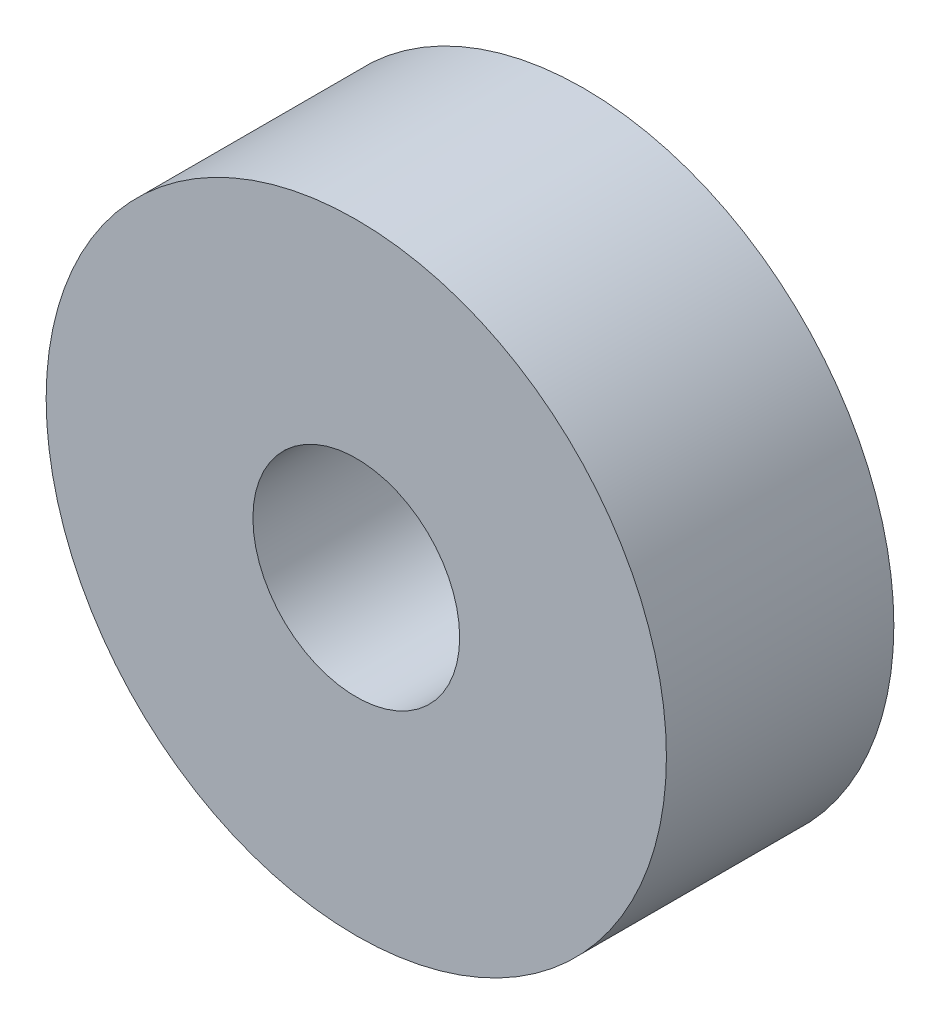
ISO-10303-21;
HEADER;
FILE_DESCRIPTION(('STEP AP214'),'2;1');
FILE_NAME('part.step','',(''),(''),'','','');
FILE_SCHEMA(('AUTOMOTIVE_DESIGN { 1 0 10303 214 1 1 1 1 }'));
ENDSEC;
DATA;
#1=APPLICATION_CONTEXT('core data for automotive mechanical design processes');
#2=APPLICATION_PROTOCOL_DEFINITION('international standard','automotive_design',2000,#1);
#3=PRODUCT_CONTEXT('',#1,'mechanical');
#4=PRODUCT('Part','Part','',(#3));
#5=PRODUCT_RELATED_PRODUCT_CATEGORY('part','',(#4));
#6=PRODUCT_DEFINITION_FORMATION('','',#4);
#7=PRODUCT_DEFINITION_CONTEXT('part definition',#1,'design');
#8=PRODUCT_DEFINITION('design','',#6,#7);
#9=PRODUCT_DEFINITION_SHAPE('','',#8);
#10=(LENGTH_UNIT() NAMED_UNIT(*) SI_UNIT(.MILLI.,.METRE.));
#11=(NAMED_UNIT(*) PLANE_ANGLE_UNIT() SI_UNIT($,.RADIAN.));
#12=(NAMED_UNIT(*) SI_UNIT($,.STERADIAN.) SOLID_ANGLE_UNIT());
#13=UNCERTAINTY_MEASURE_WITH_UNIT(LENGTH_MEASURE(1.E-05),#10,'distance_accuracy_value','');
#14=(GEOMETRIC_REPRESENTATION_CONTEXT(3) GLOBAL_UNCERTAINTY_ASSIGNED_CONTEXT((#13)) GLOBAL_UNIT_ASSIGNED_CONTEXT((#10,
#11,#12)) REPRESENTATION_CONTEXT('',''));
#15=CARTESIAN_POINT('',(0.,0.,0.));
#16=DIRECTION('',(0.,0.,1.));
#17=DIRECTION('',(1.,0.,0.));
#18=AXIS2_PLACEMENT_3D('',#15,#16,#17);
#19=CARTESIAN_POINT('',(0.,0.,2.2));
#20=DIRECTION('',(0.,0.,1.));
#21=DIRECTION('',(1.,0.,0.));
#22=AXIS2_PLACEMENT_3D('',#19,#20,#21);
#23=PLANE('',#22);
#24=CARTESIAN_POINT('',(0.,0.,2.2));
#25=DIRECTION('',(0.,0.,1.));
#26=DIRECTION('',(1.,0.,0.));
#27=AXIS2_PLACEMENT_3D('',#24,#25,#26);
#28=CIRCLE('',#27,3.);
#29=CARTESIAN_POINT('',(3.,0.,2.2));
#30=VERTEX_POINT('',#29);
#31=EDGE_CURVE('E10',#30,#30,#28,.T.);
#32=ORIENTED_EDGE('',*,*,#31,.T.);
#33=EDGE_LOOP('',(#32));
#34=FACE_BOUND('',#33,.T.);
#35=CARTESIAN_POINT('',(0.,0.,2.2));
#36=DIRECTION('',(0.,0.,1.));
#37=DIRECTION('',(1.,0.,0.));
#38=AXIS2_PLACEMENT_3D('',#35,#36,#37);
#39=CIRCLE('',#38,1.);
#40=CARTESIAN_POINT('',(1.,0.,2.2));
#41=VERTEX_POINT('',#40);
#42=EDGE_CURVE('E42',#41,#41,#39,.T.);
#43=ORIENTED_EDGE('',*,*,#42,.F.);
#44=EDGE_LOOP('',(#43));
#45=FACE_BOUND('',#44,.T.);
#46=ADVANCED_FACE('F31',(#34,#45),#23,.T.);
#47=CARTESIAN_POINT('',(0.,0.,0.));
#48=DIRECTION('',(0.,0.,1.));
#49=DIRECTION('',(1.,0.,0.));
#50=AXIS2_PLACEMENT_3D('',#47,#48,#49);
#51=PLANE('',#50);
#52=CARTESIAN_POINT('',(0.,0.,0.));
#53=DIRECTION('',(0.,0.,1.));
#54=DIRECTION('',(1.,0.,0.));
#55=AXIS2_PLACEMENT_3D('',#52,#53,#54);
#56=CIRCLE('',#55,3.);
#57=CARTESIAN_POINT('',(3.,0.,0.));
#58=VERTEX_POINT('',#57);
#59=EDGE_CURVE('E35',#58,#58,#56,.T.);
#60=ORIENTED_EDGE('',*,*,#59,.F.);
#61=EDGE_LOOP('',(#60));
#62=FACE_BOUND('',#61,.T.);
#63=CARTESIAN_POINT('',(0.,0.,0.));
#64=DIRECTION('',(0.,0.,1.));
#65=DIRECTION('',(1.,0.,0.));
#66=AXIS2_PLACEMENT_3D('',#63,#64,#65);
#67=CIRCLE('',#66,1.);
#68=CARTESIAN_POINT('',(1.,0.,0.));
#69=VERTEX_POINT('',#68);
#70=EDGE_CURVE('E44',#69,#69,#67,.T.);
#71=ORIENTED_EDGE('',*,*,#70,.T.);
#72=EDGE_LOOP('',(#71));
#73=FACE_BOUND('',#72,.T.);
#74=ADVANCED_FACE('F54',(#62,#73),#51,.F.);
#75=CARTESIAN_POINT('',(0.,0.,2.2));
#76=DIRECTION('',(0.,0.,-1.));
#77=DIRECTION('',(-1.,0.,0.));
#78=AXIS2_PLACEMENT_3D('',#75,#76,#77);
#79=CYLINDRICAL_SURFACE('',#78,3.);
#80=ORIENTED_EDGE('',*,*,#31,.F.);
#81=EDGE_LOOP('',(#80));
#82=FACE_BOUND('',#81,.T.);
#83=ORIENTED_EDGE('',*,*,#59,.T.);
#84=EDGE_LOOP('',(#83));
#85=FACE_BOUND('',#84,.T.);
#86=ADVANCED_FACE('F33',(#82,#85),#79,.T.);
#87=CARTESIAN_POINT('',(0.,0.,2.2));
#88=DIRECTION('',(0.,0.,-1.));
#89=DIRECTION('',(-1.,0.,0.));
#90=AXIS2_PLACEMENT_3D('',#87,#88,#89);
#91=CYLINDRICAL_SURFACE('',#90,1.);
#92=ORIENTED_EDGE('',*,*,#42,.T.);
#93=EDGE_LOOP('',(#92));
#94=FACE_BOUND('',#93,.T.);
#95=ORIENTED_EDGE('',*,*,#70,.F.);
#96=EDGE_LOOP('',(#95));
#97=FACE_BOUND('',#96,.T.);
#98=ADVANCED_FACE('F50',(#94,#97),#91,.F.);
#99=CLOSED_SHELL('',(#46,#74,#86,#98));
#100=MANIFOLD_SOLID_BREP('B2',#99);
#101=ADVANCED_BREP_SHAPE_REPRESENTATION('',(#18,#100),#14);
#102=SHAPE_DEFINITION_REPRESENTATION(#9,#101);
ENDSEC;
END-ISO-10303-21;
